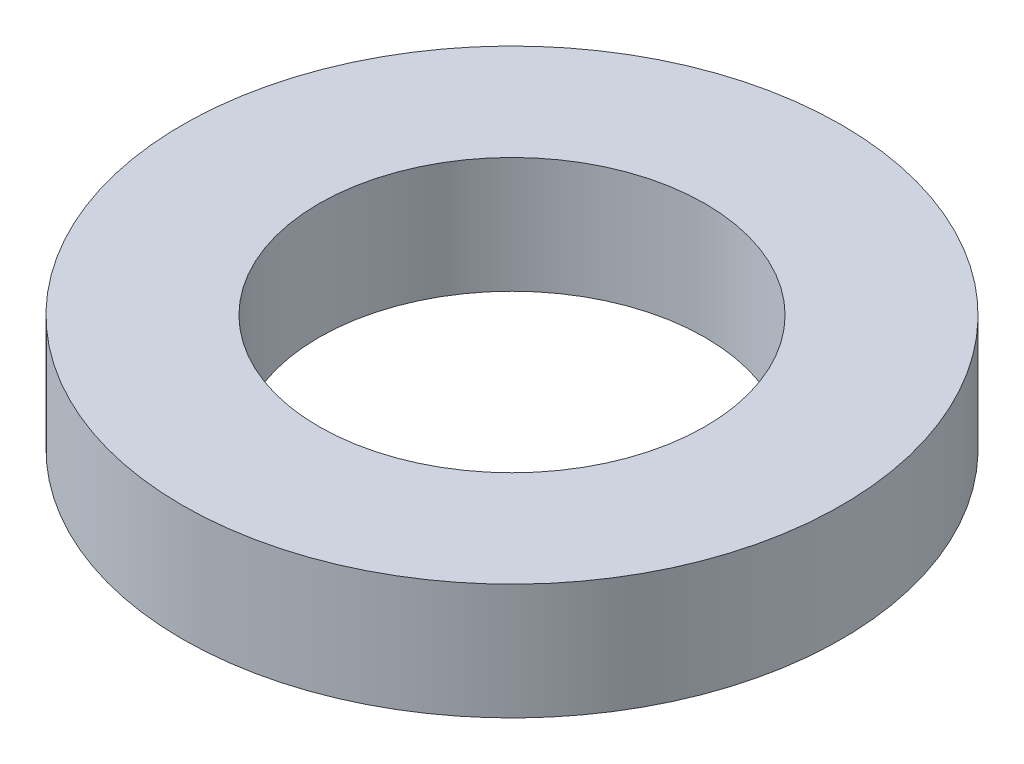
ISO-10303-21;
HEADER;
FILE_DESCRIPTION(('STEP AP214'),'2;1');
FILE_NAME('part.step','',(''),(''),'','','');
FILE_SCHEMA(('AUTOMOTIVE_DESIGN { 1 0 10303 214 1 1 1 1 }'));
ENDSEC;
DATA;
#1=APPLICATION_CONTEXT('core data for automotive mechanical design processes');
#2=APPLICATION_PROTOCOL_DEFINITION('international standard','automotive_design',2000,#1);
#3=PRODUCT_CONTEXT('',#1,'mechanical');
#4=PRODUCT('Part','Part','',(#3));
#5=PRODUCT_RELATED_PRODUCT_CATEGORY('part','',(#4));
#6=PRODUCT_DEFINITION_FORMATION('','',#4);
#7=PRODUCT_DEFINITION_CONTEXT('part definition',#1,'design');
#8=PRODUCT_DEFINITION('design','',#6,#7);
#9=PRODUCT_DEFINITION_SHAPE('','',#8);
#10=(LENGTH_UNIT() NAMED_UNIT(*) SI_UNIT(.MILLI.,.METRE.));
#11=(NAMED_UNIT(*) PLANE_ANGLE_UNIT() SI_UNIT($,.RADIAN.));
#12=(NAMED_UNIT(*) SI_UNIT($,.STERADIAN.) SOLID_ANGLE_UNIT());
#13=UNCERTAINTY_MEASURE_WITH_UNIT(LENGTH_MEASURE(1.E-05),#10,'distance_accuracy_value','');
#14=(GEOMETRIC_REPRESENTATION_CONTEXT(3) GLOBAL_UNCERTAINTY_ASSIGNED_CONTEXT((#13)) GLOBAL_UNIT_ASSIGNED_CONTEXT((#10,
#11,#12)) REPRESENTATION_CONTEXT('',''));
#15=CARTESIAN_POINT('',(0.,0.,0.));
#16=DIRECTION('',(0.,0.,1.));
#17=DIRECTION('',(1.,0.,0.));
#18=AXIS2_PLACEMENT_3D('',#15,#16,#17);
#19=CARTESIAN_POINT('',(0.,4.5,0.));
#20=DIRECTION('',(0.,1.,0.));
#21=DIRECTION('',(0.,0.,1.));
#22=AXIS2_PLACEMENT_3D('',#19,#20,#21);
#23=PLANE('',#22);
#24=CARTESIAN_POINT('',(0.,4.5,0.));
#25=DIRECTION('',(0.,1.,0.));
#26=DIRECTION('',(0.,0.,1.));
#27=AXIS2_PLACEMENT_3D('',#24,#25,#26);
#28=CIRCLE('',#27,12.8);
#29=CARTESIAN_POINT('',(0.,4.5,12.8));
#30=VERTEX_POINT('',#29);
#31=EDGE_CURVE('E10',#30,#30,#28,.T.);
#32=ORIENTED_EDGE('',*,*,#31,.T.);
#33=EDGE_LOOP('',(#32));
#34=FACE_BOUND('',#33,.T.);
#35=CARTESIAN_POINT('',(0.,4.5,0.));
#36=DIRECTION('',(0.,1.,0.));
#37=DIRECTION('',(0.,0.,1.));
#38=AXIS2_PLACEMENT_3D('',#35,#36,#37);
#39=CIRCLE('',#38,7.5);
#40=CARTESIAN_POINT('',(0.,4.5,7.5));
#41=VERTEX_POINT('',#40);
#42=EDGE_CURVE('E42',#41,#41,#39,.T.);
#43=ORIENTED_EDGE('',*,*,#42,.F.);
#44=EDGE_LOOP('',(#43));
#45=FACE_BOUND('',#44,.T.);
#46=ADVANCED_FACE('F31',(#34,#45),#23,.T.);
#47=CARTESIAN_POINT('',(0.,0.,0.));
#48=DIRECTION('',(0.,1.,0.));
#49=DIRECTION('',(0.,0.,1.));
#50=AXIS2_PLACEMENT_3D('',#47,#48,#49);
#51=PLANE('',#50);
#52=CARTESIAN_POINT('',(0.,0.,0.));
#53=DIRECTION('',(0.,1.,0.));
#54=DIRECTION('',(0.,0.,1.));
#55=AXIS2_PLACEMENT_3D('',#52,#53,#54);
#56=CIRCLE('',#55,12.8);
#57=CARTESIAN_POINT('',(0.,0.,12.8));
#58=VERTEX_POINT('',#57);
#59=EDGE_CURVE('E35',#58,#58,#56,.T.);
#60=ORIENTED_EDGE('',*,*,#59,.F.);
#61=EDGE_LOOP('',(#60));
#62=FACE_BOUND('',#61,.T.);
#63=CARTESIAN_POINT('',(0.,0.,0.));
#64=DIRECTION('',(0.,1.,0.));
#65=DIRECTION('',(0.,0.,1.));
#66=AXIS2_PLACEMENT_3D('',#63,#64,#65);
#67=CIRCLE('',#66,7.5);
#68=CARTESIAN_POINT('',(0.,0.,7.5));
#69=VERTEX_POINT('',#68);
#70=EDGE_CURVE('E44',#69,#69,#67,.T.);
#71=ORIENTED_EDGE('',*,*,#70,.T.);
#72=EDGE_LOOP('',(#71));
#73=FACE_BOUND('',#72,.T.);
#74=ADVANCED_FACE('F54',(#62,#73),#51,.F.);
#75=CARTESIAN_POINT('',(0.,4.5,0.));
#76=DIRECTION('',(0.,-1.,0.));
#77=DIRECTION('',(0.,0.,-1.));
#78=AXIS2_PLACEMENT_3D('',#75,#76,#77);
#79=CYLINDRICAL_SURFACE('',#78,12.8);
#80=ORIENTED_EDGE('',*,*,#31,.F.);
#81=EDGE_LOOP('',(#80));
#82=FACE_BOUND('',#81,.T.);
#83=ORIENTED_EDGE('',*,*,#59,.T.);
#84=EDGE_LOOP('',(#83));
#85=FACE_BOUND('',#84,.T.);
#86=ADVANCED_FACE('F33',(#82,#85),#79,.T.);
#87=CARTESIAN_POINT('',(0.,4.5,0.));
#88=DIRECTION('',(0.,-1.,0.));
#89=DIRECTION('',(0.,0.,-1.));
#90=AXIS2_PLACEMENT_3D('',#87,#88,#89);
#91=CYLINDRICAL_SURFACE('',#90,7.5);
#92=ORIENTED_EDGE('',*,*,#42,.T.);
#93=EDGE_LOOP('',(#92));
#94=FACE_BOUND('',#93,.T.);
#95=ORIENTED_EDGE('',*,*,#70,.F.);
#96=EDGE_LOOP('',(#95));
#97=FACE_BOUND('',#96,.T.);
#98=ADVANCED_FACE('F50',(#94,#97),#91,.F.);
#99=CLOSED_SHELL('',(#46,#74,#86,#98));
#100=MANIFOLD_SOLID_BREP('B2',#99);
#101=ADVANCED_BREP_SHAPE_REPRESENTATION('',(#18,#100),#14);
#102=SHAPE_DEFINITION_REPRESENTATION(#9,#101);
ENDSEC;
END-ISO-10303-21;
